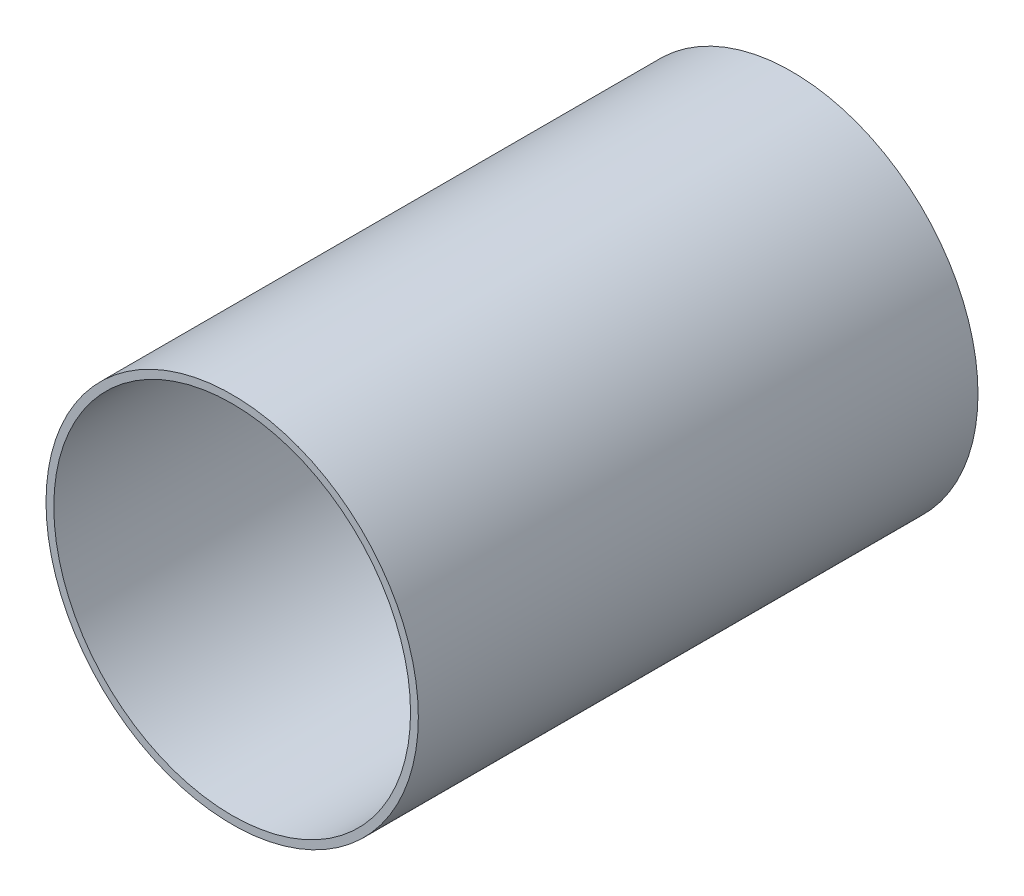
ISO-10303-21;
HEADER;
FILE_DESCRIPTION(('STEP AP214'),'2;1');
FILE_NAME('part.step','',(''),(''),'','','');
FILE_SCHEMA(('AUTOMOTIVE_DESIGN { 1 0 10303 214 1 1 1 1 }'));
ENDSEC;
DATA;
#1=APPLICATION_CONTEXT('core data for automotive mechanical design processes');
#2=APPLICATION_PROTOCOL_DEFINITION('international standard','automotive_design',2000,#1);
#3=PRODUCT_CONTEXT('',#1,'mechanical');
#4=PRODUCT('Part','Part','',(#3));
#5=PRODUCT_RELATED_PRODUCT_CATEGORY('part','',(#4));
#6=PRODUCT_DEFINITION_FORMATION('','',#4);
#7=PRODUCT_DEFINITION_CONTEXT('part definition',#1,'design');
#8=PRODUCT_DEFINITION('design','',#6,#7);
#9=PRODUCT_DEFINITION_SHAPE('','',#8);
#10=(LENGTH_UNIT() NAMED_UNIT(*) SI_UNIT(.MILLI.,.METRE.));
#11=(NAMED_UNIT(*) PLANE_ANGLE_UNIT() SI_UNIT($,.RADIAN.));
#12=(NAMED_UNIT(*) SI_UNIT($,.STERADIAN.) SOLID_ANGLE_UNIT());
#13=UNCERTAINTY_MEASURE_WITH_UNIT(LENGTH_MEASURE(1.E-05),#10,'distance_accuracy_value','');
#14=(GEOMETRIC_REPRESENTATION_CONTEXT(3) GLOBAL_UNCERTAINTY_ASSIGNED_CONTEXT((#13)) GLOBAL_UNIT_ASSIGNED_CONTEXT((#10,
#11,#12)) REPRESENTATION_CONTEXT('',''));
#15=CARTESIAN_POINT('',(0.,0.,0.));
#16=DIRECTION('',(0.,0.,1.));
#17=DIRECTION('',(1.,0.,0.));
#18=AXIS2_PLACEMENT_3D('',#15,#16,#17);
#19=CARTESIAN_POINT('',(0.,0.,80.));
#20=DIRECTION('',(0.,0.,1.));
#21=DIRECTION('',(1.,0.,0.));
#22=AXIS2_PLACEMENT_3D('',#19,#20,#21);
#23=PLANE('',#22);
#24=CARTESIAN_POINT('',(0.,0.,80.));
#25=DIRECTION('',(0.,0.,1.));
#26=DIRECTION('',(1.,0.,0.));
#27=AXIS2_PLACEMENT_3D('',#24,#25,#26);
#28=CIRCLE('',#27,47.7344164766625);
#29=CARTESIAN_POINT('',(47.7344164766625,0.,80.));
#30=VERTEX_POINT('',#29);
#31=EDGE_CURVE('E10',#30,#30,#28,.T.);
#32=ORIENTED_EDGE('',*,*,#31,.T.);
#33=EDGE_LOOP('',(#32));
#34=FACE_BOUND('',#33,.T.);
#35=CARTESIAN_POINT('',(0.,0.,80.));
#36=DIRECTION('',(0.,0.,1.));
#37=DIRECTION('',(1.,0.,0.));
#38=AXIS2_PLACEMENT_3D('',#35,#36,#37);
#39=CIRCLE('',#38,45.7344164766625);
#40=CARTESIAN_POINT('',(45.7344164766625,0.,80.));
#41=VERTEX_POINT('',#40);
#42=EDGE_CURVE('E43',#41,#41,#39,.T.);
#43=ORIENTED_EDGE('',*,*,#42,.F.);
#44=EDGE_LOOP('',(#43));
#45=FACE_BOUND('',#44,.T.);
#46=ADVANCED_FACE('F35',(#34,#45),#23,.T.);
#47=CARTESIAN_POINT('',(0.,0.,80.));
#48=DIRECTION('',(0.,0.,-1.));
#49=DIRECTION('',(-1.,0.,0.));
#50=AXIS2_PLACEMENT_3D('',#47,#48,#49);
#51=CYLINDRICAL_SURFACE('',#50,47.7344164766625);
#52=ORIENTED_EDGE('',*,*,#31,.F.);
#53=EDGE_LOOP('',(#52));
#54=FACE_BOUND('',#53,.T.);
#55=CARTESIAN_POINT('',(0.,0.,-63.5));
#56=DIRECTION('',(0.,0.,-1.));
#57=DIRECTION('',(-1.,0.,0.));
#58=AXIS2_PLACEMENT_3D('',#55,#56,#57);
#59=CIRCLE('',#58,47.7344164766625);
#60=CARTESIAN_POINT('',(-47.7344164766625,0.,-63.5));
#61=VERTEX_POINT('',#60);
#62=EDGE_CURVE('E53',#61,#61,#59,.F.);
#63=ORIENTED_EDGE('',*,*,#62,.T.);
#64=EDGE_LOOP('',(#63));
#65=FACE_BOUND('',#64,.T.);
#66=ADVANCED_FACE('F37',(#54,#65),#51,.T.);
#67=CARTESIAN_POINT('',(0.,0.,80.));
#68=DIRECTION('',(0.,0.,-1.));
#69=DIRECTION('',(-1.,0.,0.));
#70=AXIS2_PLACEMENT_3D('',#67,#68,#69);
#71=CYLINDRICAL_SURFACE('',#70,45.7344164766625);
#72=ORIENTED_EDGE('',*,*,#42,.T.);
#73=EDGE_LOOP('',(#72));
#74=FACE_BOUND('',#73,.T.);
#75=CARTESIAN_POINT('',(0.,0.,-63.5));
#76=DIRECTION('',(0.,0.,-1.));
#77=DIRECTION('',(-1.,0.,0.));
#78=AXIS2_PLACEMENT_3D('',#75,#76,#77);
#79=CIRCLE('',#78,45.7344164766625);
#80=CARTESIAN_POINT('',(-45.7344164766625,0.,-63.5));
#81=VERTEX_POINT('',#80);
#82=EDGE_CURVE('E48',#81,#81,#79,.F.);
#83=ORIENTED_EDGE('',*,*,#82,.F.);
#84=EDGE_LOOP('',(#83));
#85=FACE_BOUND('',#84,.T.);
#86=ADVANCED_FACE('F64',(#74,#85),#71,.F.);
#87=CARTESIAN_POINT('',(0.,0.,-63.5));
#88=DIRECTION('',(0.,0.,-1.));
#89=DIRECTION('',(-1.,0.,0.));
#90=AXIS2_PLACEMENT_3D('',#87,#88,#89);
#91=PLANE('',#90);
#92=ORIENTED_EDGE('',*,*,#62,.F.);
#93=EDGE_LOOP('',(#92));
#94=FACE_BOUND('',#93,.T.);
#95=ORIENTED_EDGE('',*,*,#82,.T.);
#96=EDGE_LOOP('',(#95));
#97=FACE_BOUND('',#96,.T.);
#98=ADVANCED_FACE('F61',(#94,#97),#91,.T.);
#99=CLOSED_SHELL('',(#46,#66,#86,#98));
#100=MANIFOLD_SOLID_BREP('B2',#99);
#101=ADVANCED_BREP_SHAPE_REPRESENTATION('',(#18,#100),#14);
#102=SHAPE_DEFINITION_REPRESENTATION(#9,#101);
ENDSEC;
END-ISO-10303-21;
